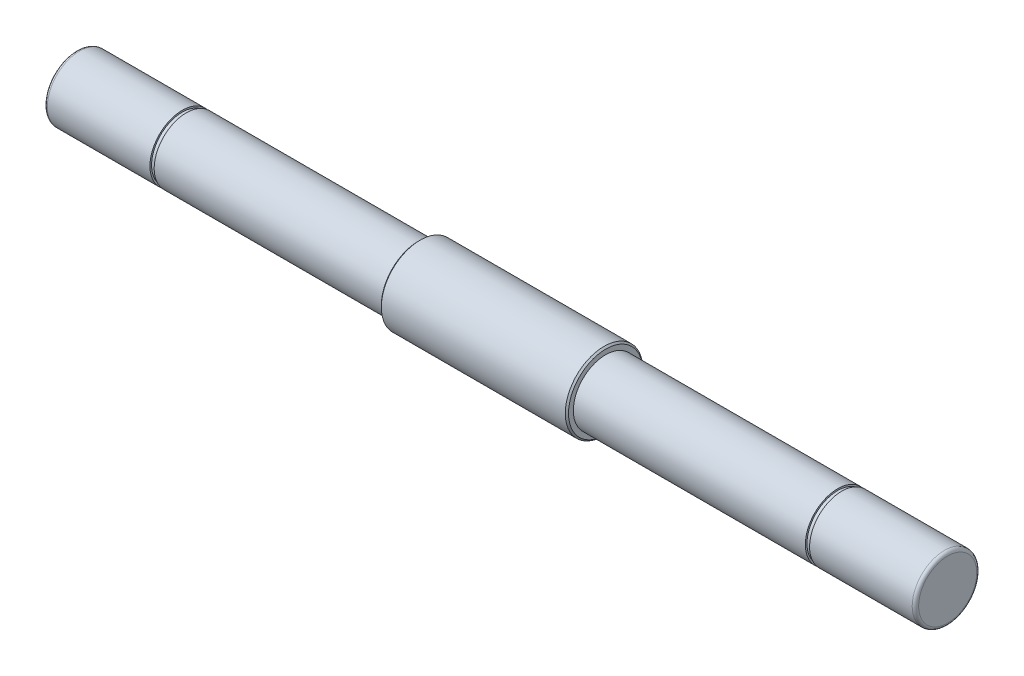
ISO-10303-21;
HEADER;
FILE_DESCRIPTION(('STEP AP214'),'2;1');
FILE_NAME('part.step','',(''),(''),'','','');
FILE_SCHEMA(('AUTOMOTIVE_DESIGN { 1 0 10303 214 1 1 1 1 }'));
ENDSEC;
DATA;
#1=APPLICATION_CONTEXT('core data for automotive mechanical design processes');
#2=APPLICATION_PROTOCOL_DEFINITION('international standard','automotive_design',2000,#1);
#3=PRODUCT_CONTEXT('',#1,'mechanical');
#4=PRODUCT('Part','Part','',(#3));
#5=PRODUCT_RELATED_PRODUCT_CATEGORY('part','',(#4));
#6=PRODUCT_DEFINITION_FORMATION('','',#4);
#7=PRODUCT_DEFINITION_CONTEXT('part definition',#1,'design');
#8=PRODUCT_DEFINITION('design','',#6,#7);
#9=PRODUCT_DEFINITION_SHAPE('','',#8);
#10=(LENGTH_UNIT() NAMED_UNIT(*) SI_UNIT(.MILLI.,.METRE.));
#11=(NAMED_UNIT(*) PLANE_ANGLE_UNIT() SI_UNIT($,.RADIAN.));
#12=(NAMED_UNIT(*) SI_UNIT($,.STERADIAN.) SOLID_ANGLE_UNIT());
#13=UNCERTAINTY_MEASURE_WITH_UNIT(LENGTH_MEASURE(1.E-05),#10,'distance_accuracy_value','');
#14=(GEOMETRIC_REPRESENTATION_CONTEXT(3) GLOBAL_UNCERTAINTY_ASSIGNED_CONTEXT((#13)) GLOBAL_UNIT_ASSIGNED_CONTEXT((#10,
#11,#12)) REPRESENTATION_CONTEXT('',''));
#15=CARTESIAN_POINT('',(0.,0.,0.));
#16=DIRECTION('',(0.,0.,1.));
#17=DIRECTION('',(1.,0.,0.));
#18=AXIS2_PLACEMENT_3D('',#15,#16,#17);
#19=CARTESIAN_POINT('',(-135.,0.,0.));
#20=DIRECTION('',(-1.,0.,0.));
#21=DIRECTION('',(0.,0.,1.));
#22=AXIS2_PLACEMENT_3D('',#19,#20,#21);
#23=PLANE('',#22);
#24=CARTESIAN_POINT('',(-135.,0.,0.));
#25=DIRECTION('',(-1.,0.,0.));
#26=DIRECTION('',(0.,0.,1.));
#27=AXIS2_PLACEMENT_3D('',#24,#25,#26);
#28=CIRCLE('',#27,9.);
#29=CARTESIAN_POINT('',(-135.,0.,9.));
#30=VERTEX_POINT('',#29);
#31=EDGE_CURVE('E44',#30,#30,#28,.T.);
#32=ORIENTED_EDGE('',*,*,#31,.T.);
#33=EDGE_LOOP('',(#32));
#34=FACE_BOUND('',#33,.T.);
#35=ADVANCED_FACE('F37',(#34),#23,.T.);
#36=CARTESIAN_POINT('',(135.,0.,0.));
#37=DIRECTION('',(-1.,0.,0.));
#38=DIRECTION('',(0.,0.,1.));
#39=AXIS2_PLACEMENT_3D('',#36,#37,#38);
#40=PLANE('',#39);
#41=CARTESIAN_POINT('',(135.,0.,0.));
#42=DIRECTION('',(-1.,0.,0.));
#43=DIRECTION('',(0.,0.,1.));
#44=AXIS2_PLACEMENT_3D('',#41,#42,#43);
#45=CIRCLE('',#44,9.);
#46=CARTESIAN_POINT('',(135.,0.,9.));
#47=VERTEX_POINT('',#46);
#48=EDGE_CURVE('E48',#47,#47,#45,.F.);
#49=ORIENTED_EDGE('',*,*,#48,.T.);
#50=EDGE_LOOP('',(#49));
#51=FACE_BOUND('',#50,.T.);
#52=ADVANCED_FACE('F117',(#51),#40,.F.);
#53=CARTESIAN_POINT('',(-135.,0.,0.));
#54=DIRECTION('',(-1.,0.,0.));
#55=DIRECTION('',(0.,0.,1.));
#56=AXIS2_PLACEMENT_3D('',#53,#54,#55);
#57=CYLINDRICAL_SURFACE('',#56,10.);
#58=CARTESIAN_POINT('',(134.,0.,0.));
#59=DIRECTION('',(-1.,0.,0.));
#60=DIRECTION('',(0.,0.,1.));
#61=AXIS2_PLACEMENT_3D('',#58,#59,#60);
#62=CIRCLE('',#61,10.);
#63=CARTESIAN_POINT('',(134.,0.,10.));
#64=VERTEX_POINT('',#63);
#65=EDGE_CURVE('E52',#64,#64,#62,.T.);
#66=ORIENTED_EDGE('',*,*,#65,.T.);
#67=EDGE_LOOP('',(#66));
#68=FACE_BOUND('',#67,.T.);
#69=CARTESIAN_POINT('',(102.2,0.,0.));
#70=DIRECTION('',(-1.,0.,0.));
#71=DIRECTION('',(0.,0.,1.));
#72=AXIS2_PLACEMENT_3D('',#69,#70,#71);
#73=CIRCLE('',#72,10.);
#74=CARTESIAN_POINT('',(102.2,0.,10.));
#75=VERTEX_POINT('',#74);
#76=EDGE_CURVE('E69',#75,#75,#73,.T.);
#77=ORIENTED_EDGE('',*,*,#76,.F.);
#78=EDGE_LOOP('',(#77));
#79=FACE_BOUND('',#78,.T.);
#80=ADVANCED_FACE('F122',(#68,#79),#57,.T.);
#81=CARTESIAN_POINT('',(102.2,0.,0.));
#82=DIRECTION('',(1.,0.,0.));
#83=DIRECTION('',(0.,0.,-1.));
#84=AXIS2_PLACEMENT_3D('',#81,#82,#83);
#85=PLANE('',#84);
#86=CARTESIAN_POINT('',(102.2,0.,0.));
#87=DIRECTION('',(-1.,0.,0.));
#88=DIRECTION('',(0.,0.,1.));
#89=AXIS2_PLACEMENT_3D('',#86,#87,#88);
#90=CIRCLE('',#89,9.5);
#91=CARTESIAN_POINT('',(102.2,0.,9.5));
#92=VERTEX_POINT('',#91);
#93=EDGE_CURVE('E72',#92,#92,#90,.T.);
#94=ORIENTED_EDGE('',*,*,#93,.F.);
#95=EDGE_LOOP('',(#94));
#96=FACE_BOUND('',#95,.T.);
#97=ORIENTED_EDGE('',*,*,#76,.T.);
#98=EDGE_LOOP('',(#97));
#99=FACE_BOUND('',#98,.T.);
#100=ADVANCED_FACE('F146',(#96,#99),#85,.F.);
#101=CARTESIAN_POINT('',(-135.,0.,0.));
#102=DIRECTION('',(-1.,0.,0.));
#103=DIRECTION('',(0.,0.,1.));
#104=AXIS2_PLACEMENT_3D('',#101,#102,#103);
#105=CYLINDRICAL_SURFACE('',#104,9.5);
#106=CARTESIAN_POINT('',(100.9,0.,0.));
#107=DIRECTION('',(-1.,0.,0.));
#108=DIRECTION('',(0.,0.,1.));
#109=AXIS2_PLACEMENT_3D('',#106,#107,#108);
#110=CIRCLE('',#109,9.5);
#111=CARTESIAN_POINT('',(100.9,0.,9.5));
#112=VERTEX_POINT('',#111);
#113=EDGE_CURVE('E75',#112,#112,#110,.T.);
#114=ORIENTED_EDGE('',*,*,#113,.F.);
#115=EDGE_LOOP('',(#114));
#116=FACE_BOUND('',#115,.T.);
#117=ORIENTED_EDGE('',*,*,#93,.T.);
#118=EDGE_LOOP('',(#117));
#119=FACE_BOUND('',#118,.T.);
#120=ADVANCED_FACE('F150',(#116,#119),#105,.T.);
#121=CARTESIAN_POINT('',(100.9,0.,0.));
#122=DIRECTION('',(-1.,0.,0.));
#123=DIRECTION('',(0.,0.,1.));
#124=AXIS2_PLACEMENT_3D('',#121,#122,#123);
#125=PLANE('',#124);
#126=CARTESIAN_POINT('',(100.9,0.,0.));
#127=DIRECTION('',(-1.,0.,0.));
#128=DIRECTION('',(0.,0.,1.));
#129=AXIS2_PLACEMENT_3D('',#126,#127,#128);
#130=CIRCLE('',#129,10.);
#131=CARTESIAN_POINT('',(100.9,0.,10.));
#132=VERTEX_POINT('',#131);
#133=EDGE_CURVE('E78',#132,#132,#130,.T.);
#134=ORIENTED_EDGE('',*,*,#133,.F.);
#135=EDGE_LOOP('',(#134));
#136=FACE_BOUND('',#135,.T.);
#137=ORIENTED_EDGE('',*,*,#113,.T.);
#138=EDGE_LOOP('',(#137));
#139=FACE_BOUND('',#138,.T.);
#140=ADVANCED_FACE('F156',(#136,#139),#125,.F.);
#141=CARTESIAN_POINT('',(-135.,0.,0.));
#142=DIRECTION('',(-1.,0.,0.));
#143=DIRECTION('',(0.,0.,1.));
#144=AXIS2_PLACEMENT_3D('',#141,#142,#143);
#145=CYLINDRICAL_SURFACE('',#144,10.);
#146=CARTESIAN_POINT('',(29.,0.,0.));
#147=DIRECTION('',(-1.,0.,0.));
#148=DIRECTION('',(0.,0.,1.));
#149=AXIS2_PLACEMENT_3D('',#146,#147,#148);
#150=CIRCLE('',#149,10.);
#151=CARTESIAN_POINT('',(29.,0.,10.));
#152=VERTEX_POINT('',#151);
#153=EDGE_CURVE('E81',#152,#152,#150,.T.);
#154=ORIENTED_EDGE('',*,*,#153,.F.);
#155=EDGE_LOOP('',(#154));
#156=FACE_BOUND('',#155,.T.);
#157=ORIENTED_EDGE('',*,*,#133,.T.);
#158=EDGE_LOOP('',(#157));
#159=FACE_BOUND('',#158,.T.);
#160=ADVANCED_FACE('F163',(#156,#159),#145,.T.);
#161=CARTESIAN_POINT('',(29.,0.,0.));
#162=DIRECTION('',(-1.,0.,0.));
#163=DIRECTION('',(0.,0.,1.));
#164=AXIS2_PLACEMENT_3D('',#161,#162,#163);
#165=PLANE('',#164);
#166=CARTESIAN_POINT('',(29.,0.,0.));
#167=DIRECTION('',(-1.,0.,0.));
#168=DIRECTION('',(0.,0.,1.));
#169=AXIS2_PLACEMENT_3D('',#166,#167,#168);
#170=CIRCLE('',#169,11.5);
#171=CARTESIAN_POINT('',(29.,0.,11.5));
#172=VERTEX_POINT('',#171);
#173=EDGE_CURVE('E60',#172,#172,#170,.F.);
#174=ORIENTED_EDGE('',*,*,#173,.T.);
#175=EDGE_LOOP('',(#174));
#176=FACE_BOUND('',#175,.T.);
#177=ORIENTED_EDGE('',*,*,#153,.T.);
#178=EDGE_LOOP('',(#177));
#179=FACE_BOUND('',#178,.T.);
#180=ADVANCED_FACE('F167',(#176,#179),#165,.F.);
#181=CARTESIAN_POINT('',(-135.,0.,0.));
#182=DIRECTION('',(-1.,0.,0.));
#183=DIRECTION('',(0.,0.,1.));
#184=AXIS2_PLACEMENT_3D('',#181,#182,#183);
#185=CYLINDRICAL_SURFACE('',#184,12.);
#186=CARTESIAN_POINT('',(28.4999999999999,0.,0.));
#187=DIRECTION('',(-1.,0.,0.));
#188=DIRECTION('',(0.,0.,1.));
#189=AXIS2_PLACEMENT_3D('',#186,#187,#188);
#190=CIRCLE('',#189,12.);
#191=CARTESIAN_POINT('',(28.4999999999999,0.,12.));
#192=VERTEX_POINT('',#191);
#193=EDGE_CURVE('E63',#192,#192,#190,.T.);
#194=ORIENTED_EDGE('',*,*,#193,.T.);
#195=EDGE_LOOP('',(#194));
#196=FACE_BOUND('',#195,.T.);
#197=CARTESIAN_POINT('',(-28.4999999999999,0.,0.));
#198=DIRECTION('',(-1.,0.,0.));
#199=DIRECTION('',(0.,0.,1.));
#200=AXIS2_PLACEMENT_3D('',#197,#198,#199);
#201=CIRCLE('',#200,12.);
#202=CARTESIAN_POINT('',(-28.4999999999999,0.,12.));
#203=VERTEX_POINT('',#202);
#204=EDGE_CURVE('E66',#203,#203,#201,.F.);
#205=ORIENTED_EDGE('',*,*,#204,.T.);
#206=EDGE_LOOP('',(#205));
#207=FACE_BOUND('',#206,.T.);
#208=ADVANCED_FACE('F171',(#196,#207),#185,.T.);
#209=CARTESIAN_POINT('',(-29.,0.,0.));
#210=DIRECTION('',(-1.,0.,0.));
#211=DIRECTION('',(0.,0.,1.));
#212=AXIS2_PLACEMENT_3D('',#209,#210,#211);
#213=PLANE('',#212);
#214=CARTESIAN_POINT('',(-29.,0.,0.));
#215=DIRECTION('',(-1.,0.,0.));
#216=DIRECTION('',(0.,0.,1.));
#217=AXIS2_PLACEMENT_3D('',#214,#215,#216);
#218=CIRCLE('',#217,11.5);
#219=CARTESIAN_POINT('',(-29.,0.,11.5));
#220=VERTEX_POINT('',#219);
#221=EDGE_CURVE('E57',#220,#220,#218,.T.);
#222=ORIENTED_EDGE('',*,*,#221,.T.);
#223=EDGE_LOOP('',(#222));
#224=FACE_BOUND('',#223,.T.);
#225=CARTESIAN_POINT('',(-29.,0.,0.));
#226=DIRECTION('',(-1.,0.,0.));
#227=DIRECTION('',(0.,0.,1.));
#228=AXIS2_PLACEMENT_3D('',#225,#226,#227);
#229=CIRCLE('',#228,10.);
#230=CARTESIAN_POINT('',(-29.,0.,10.));
#231=VERTEX_POINT('',#230);
#232=EDGE_CURVE('E84',#231,#231,#229,.T.);
#233=ORIENTED_EDGE('',*,*,#232,.F.);
#234=EDGE_LOOP('',(#233));
#235=FACE_BOUND('',#234,.T.);
#236=ADVANCED_FACE('F175',(#224,#235),#213,.T.);
#237=CARTESIAN_POINT('',(-135.,0.,0.));
#238=DIRECTION('',(-1.,0.,0.));
#239=DIRECTION('',(0.,0.,1.));
#240=AXIS2_PLACEMENT_3D('',#237,#238,#239);
#241=CYLINDRICAL_SURFACE('',#240,10.);
#242=ORIENTED_EDGE('',*,*,#232,.T.);
#243=EDGE_LOOP('',(#242));
#244=FACE_BOUND('',#243,.T.);
#245=CARTESIAN_POINT('',(-100.9,0.,0.));
#246=DIRECTION('',(-1.,0.,0.));
#247=DIRECTION('',(0.,0.,1.));
#248=AXIS2_PLACEMENT_3D('',#245,#246,#247);
#249=CIRCLE('',#248,10.);
#250=CARTESIAN_POINT('',(-100.9,0.,10.));
#251=VERTEX_POINT('',#250);
#252=EDGE_CURVE('E87',#251,#251,#249,.T.);
#253=ORIENTED_EDGE('',*,*,#252,.F.);
#254=EDGE_LOOP('',(#253));
#255=FACE_BOUND('',#254,.T.);
#256=ADVANCED_FACE('F179',(#244,#255),#241,.T.);
#257=CARTESIAN_POINT('',(-100.9,0.,0.));
#258=DIRECTION('',(-1.,0.,0.));
#259=DIRECTION('',(0.,0.,1.));
#260=AXIS2_PLACEMENT_3D('',#257,#258,#259);
#261=PLANE('',#260);
#262=ORIENTED_EDGE('',*,*,#252,.T.);
#263=EDGE_LOOP('',(#262));
#264=FACE_BOUND('',#263,.T.);
#265=CARTESIAN_POINT('',(-100.9,0.,0.));
#266=DIRECTION('',(-1.,0.,0.));
#267=DIRECTION('',(0.,0.,1.));
#268=AXIS2_PLACEMENT_3D('',#265,#266,#267);
#269=CIRCLE('',#268,9.5);
#270=CARTESIAN_POINT('',(-100.9,0.,9.5));
#271=VERTEX_POINT('',#270);
#272=EDGE_CURVE('E90',#271,#271,#269,.T.);
#273=ORIENTED_EDGE('',*,*,#272,.F.);
#274=EDGE_LOOP('',(#273));
#275=FACE_BOUND('',#274,.T.);
#276=ADVANCED_FACE('F113',(#264,#275),#261,.T.);
#277=CARTESIAN_POINT('',(-135.,0.,0.));
#278=DIRECTION('',(-1.,0.,0.));
#279=DIRECTION('',(0.,0.,1.));
#280=AXIS2_PLACEMENT_3D('',#277,#278,#279);
#281=CYLINDRICAL_SURFACE('',#280,9.5);
#282=ORIENTED_EDGE('',*,*,#272,.T.);
#283=EDGE_LOOP('',(#282));
#284=FACE_BOUND('',#283,.T.);
#285=CARTESIAN_POINT('',(-102.2,0.,0.));
#286=DIRECTION('',(-1.,0.,0.));
#287=DIRECTION('',(0.,0.,1.));
#288=AXIS2_PLACEMENT_3D('',#285,#286,#287);
#289=CIRCLE('',#288,9.5);
#290=CARTESIAN_POINT('',(-102.2,0.,9.5));
#291=VERTEX_POINT('',#290);
#292=EDGE_CURVE('E93',#291,#291,#289,.T.);
#293=ORIENTED_EDGE('',*,*,#292,.F.);
#294=EDGE_LOOP('',(#293));
#295=FACE_BOUND('',#294,.T.);
#296=ADVANCED_FACE('F104',(#284,#295),#281,.T.);
#297=CARTESIAN_POINT('',(-102.2,0.,0.));
#298=DIRECTION('',(1.,0.,0.));
#299=DIRECTION('',(0.,0.,-1.));
#300=AXIS2_PLACEMENT_3D('',#297,#298,#299);
#301=PLANE('',#300);
#302=ORIENTED_EDGE('',*,*,#292,.T.);
#303=EDGE_LOOP('',(#302));
#304=FACE_BOUND('',#303,.T.);
#305=CARTESIAN_POINT('',(-102.2,0.,0.));
#306=DIRECTION('',(-1.,0.,0.));
#307=DIRECTION('',(0.,0.,1.));
#308=AXIS2_PLACEMENT_3D('',#305,#306,#307);
#309=CIRCLE('',#308,10.);
#310=CARTESIAN_POINT('',(-102.2,0.,10.));
#311=VERTEX_POINT('',#310);
#312=EDGE_CURVE('E96',#311,#311,#309,.T.);
#313=ORIENTED_EDGE('',*,*,#312,.F.);
#314=EDGE_LOOP('',(#313));
#315=FACE_BOUND('',#314,.T.);
#316=ADVANCED_FACE('F102',(#304,#315),#301,.T.);
#317=CARTESIAN_POINT('',(-135.,0.,0.));
#318=DIRECTION('',(-1.,0.,0.));
#319=DIRECTION('',(0.,0.,1.));
#320=AXIS2_PLACEMENT_3D('',#317,#318,#319);
#321=CYLINDRICAL_SURFACE('',#320,10.);
#322=CARTESIAN_POINT('',(-134.,0.,0.));
#323=DIRECTION('',(-1.,0.,0.));
#324=DIRECTION('',(0.,0.,1.));
#325=AXIS2_PLACEMENT_3D('',#322,#323,#324);
#326=CIRCLE('',#325,10.);
#327=CARTESIAN_POINT('',(-134.,0.,10.));
#328=VERTEX_POINT('',#327);
#329=EDGE_CURVE('E10',#328,#328,#326,.F.);
#330=ORIENTED_EDGE('',*,*,#329,.T.);
#331=EDGE_LOOP('',(#330));
#332=FACE_BOUND('',#331,.T.);
#333=ORIENTED_EDGE('',*,*,#312,.T.);
#334=EDGE_LOOP('',(#333));
#335=FACE_BOUND('',#334,.T.);
#336=ADVANCED_FACE('F100',(#332,#335),#321,.T.);
#337=CARTESIAN_POINT('',(28.4999999999999,0.,0.));
#338=DIRECTION('',(-1.,0.,0.));
#339=DIRECTION('',(0.,0.,1.));
#340=AXIS2_PLACEMENT_3D('',#337,#338,#339);
#341=CONICAL_SURFACE('',#340,12.,0.785398163397429);
#342=ORIENTED_EDGE('',*,*,#173,.F.);
#343=EDGE_LOOP('',(#342));
#344=FACE_BOUND('',#343,.T.);
#345=ORIENTED_EDGE('',*,*,#193,.F.);
#346=EDGE_LOOP('',(#345));
#347=FACE_BOUND('',#346,.T.);
#348=ADVANCED_FACE('F111',(#344,#347),#341,.T.);
#349=CARTESIAN_POINT('',(-29.,0.,0.));
#350=DIRECTION('',(1.,0.,0.));
#351=DIRECTION('',(0.,0.,-1.));
#352=AXIS2_PLACEMENT_3D('',#349,#350,#351);
#353=CONICAL_SURFACE('',#352,11.5,0.785398163397428);
#354=ORIENTED_EDGE('',*,*,#204,.F.);
#355=EDGE_LOOP('',(#354));
#356=FACE_BOUND('',#355,.T.);
#357=ORIENTED_EDGE('',*,*,#221,.F.);
#358=EDGE_LOOP('',(#357));
#359=FACE_BOUND('',#358,.T.);
#360=ADVANCED_FACE('F129',(#356,#359),#353,.T.);
#361=CARTESIAN_POINT('',(134.,0.,0.));
#362=DIRECTION('',(-1.,0.,0.));
#363=DIRECTION('',(0.,0.,1.));
#364=AXIS2_PLACEMENT_3D('',#361,#362,#363);
#365=TOROIDAL_SURFACE('',#364,9.,1.);
#366=ORIENTED_EDGE('',*,*,#48,.F.);
#367=EDGE_LOOP('',(#366));
#368=FACE_BOUND('',#367,.T.);
#369=ORIENTED_EDGE('',*,*,#65,.F.);
#370=EDGE_LOOP('',(#369));
#371=FACE_BOUND('',#370,.T.);
#372=ADVANCED_FACE('F132',(#368,#371),#365,.T.);
#373=CARTESIAN_POINT('',(-134.,0.,0.));
#374=DIRECTION('',(-1.,0.,0.));
#375=DIRECTION('',(0.,0.,1.));
#376=AXIS2_PLACEMENT_3D('',#373,#374,#375);
#377=TOROIDAL_SURFACE('',#376,9.,1.);
#378=ORIENTED_EDGE('',*,*,#329,.F.);
#379=EDGE_LOOP('',(#378));
#380=FACE_BOUND('',#379,.T.);
#381=ORIENTED_EDGE('',*,*,#31,.F.);
#382=EDGE_LOOP('',(#381));
#383=FACE_BOUND('',#382,.T.);
#384=ADVANCED_FACE('F39',(#380,#383),#377,.T.);
#385=CLOSED_SHELL('',(#35,#52,#80,#100,#120,#140,#160,#180,#208,#236,#256,#276,#296,#316,#336,
#348,#360,#372,#384));
#386=MANIFOLD_SOLID_BREP('B2',#385);
#387=ADVANCED_BREP_SHAPE_REPRESENTATION('',(#18,#386),#14);
#388=SHAPE_DEFINITION_REPRESENTATION(#9,#387);
ENDSEC;
END-ISO-10303-21;
